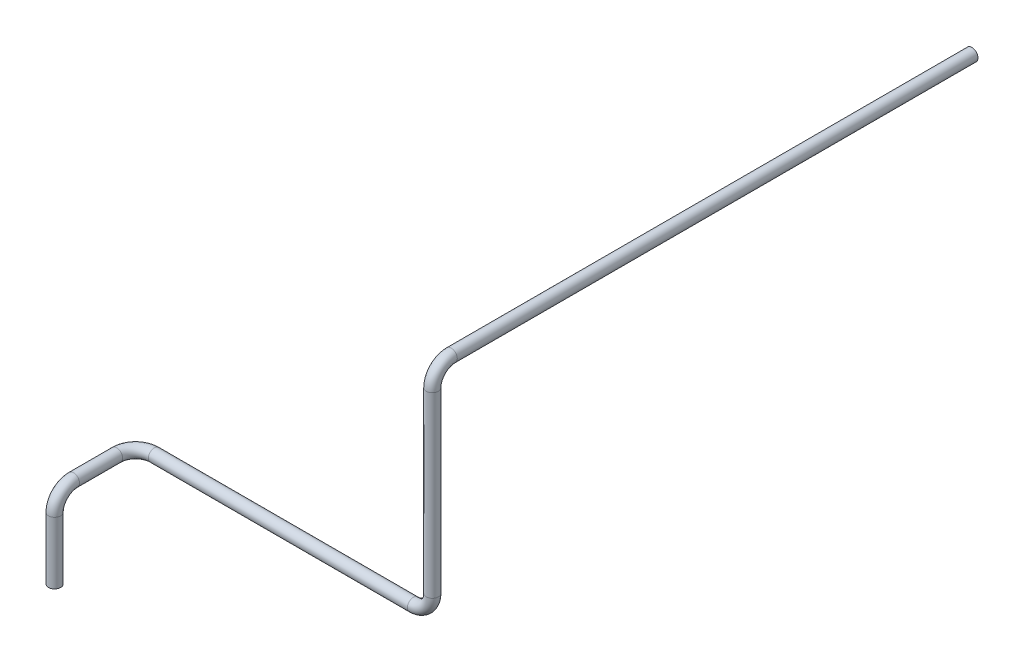
ISO-10303-21;
HEADER;
FILE_DESCRIPTION(('STEP AP214'),'2;1');
FILE_NAME('part.step','',(''),(''),'','','');
FILE_SCHEMA(('AUTOMOTIVE_DESIGN { 1 0 10303 214 1 1 1 1 }'));
ENDSEC;
DATA;
#1=APPLICATION_CONTEXT('core data for automotive mechanical design processes');
#2=APPLICATION_PROTOCOL_DEFINITION('international standard','automotive_design',2000,#1);
#3=PRODUCT_CONTEXT('',#1,'mechanical');
#4=PRODUCT('Part','Part','',(#3));
#5=PRODUCT_RELATED_PRODUCT_CATEGORY('part','',(#4));
#6=PRODUCT_DEFINITION_FORMATION('','',#4);
#7=PRODUCT_DEFINITION_CONTEXT('part definition',#1,'design');
#8=PRODUCT_DEFINITION('design','',#6,#7);
#9=PRODUCT_DEFINITION_SHAPE('','',#8);
#10=(LENGTH_UNIT() NAMED_UNIT(*) SI_UNIT(.MILLI.,.METRE.));
#11=(NAMED_UNIT(*) PLANE_ANGLE_UNIT() SI_UNIT($,.RADIAN.));
#12=(NAMED_UNIT(*) SI_UNIT($,.STERADIAN.) SOLID_ANGLE_UNIT());
#13=UNCERTAINTY_MEASURE_WITH_UNIT(LENGTH_MEASURE(1.E-05),#10,'distance_accuracy_value','');
#14=(GEOMETRIC_REPRESENTATION_CONTEXT(3) GLOBAL_UNCERTAINTY_ASSIGNED_CONTEXT((#13)) GLOBAL_UNIT_ASSIGNED_CONTEXT((#10,
#11,#12)) REPRESENTATION_CONTEXT('',''));
#15=CARTESIAN_POINT('',(0.,0.,0.));
#16=DIRECTION('',(0.,0.,1.));
#17=DIRECTION('',(1.,0.,0.));
#18=AXIS2_PLACEMENT_3D('',#15,#16,#17);
#19=CARTESIAN_POINT('',(0.,0.,100.));
#20=DIRECTION('',(0.,0.,-1.));
#21=DIRECTION('',(-1.,0.,0.));
#22=AXIS2_PLACEMENT_3D('',#19,#20,#21);
#23=CYLINDRICAL_SURFACE('',#22,22.5);
#24=CARTESIAN_POINT('',(0.,0.,0.));
#25=DIRECTION('',(0.,0.,1.));
#26=DIRECTION('',(1.,0.,0.));
#27=AXIS2_PLACEMENT_3D('',#24,#25,#26);
#28=CIRCLE('',#27,22.5);
#29=CARTESIAN_POINT('',(22.5,0.,0.));
#30=VERTEX_POINT('',#29);
#31=EDGE_CURVE('E11',#30,#30,#28,.T.);
#32=ORIENTED_EDGE('',*,*,#31,.T.);
#33=EDGE_LOOP('',(#32));
#34=FACE_BOUND('',#33,.T.);
#35=CARTESIAN_POINT('',(0.,0.,1930.));
#36=DIRECTION('',(0.,0.,1.));
#37=DIRECTION('',(1.,0.,0.));
#38=AXIS2_PLACEMENT_3D('',#35,#36,#37);
#39=CIRCLE('',#38,22.5);
#40=CARTESIAN_POINT('',(0.,22.5,1930.));
#41=VERTEX_POINT('',#40);
#42=EDGE_CURVE('E71',#41,#41,#39,.T.);
#43=ORIENTED_EDGE('',*,*,#42,.F.);
#44=EDGE_LOOP('',(#43));
#45=FACE_BOUND('',#44,.T.);
#46=ADVANCED_FACE('F37',(#34,#45),#23,.T.);
#47=CARTESIAN_POINT('',(0.,0.,0.));
#48=DIRECTION('',(0.,0.,1.));
#49=DIRECTION('',(1.,0.,0.));
#50=AXIS2_PLACEMENT_3D('',#47,#48,#49);
#51=PLANE('',#50);
#52=ORIENTED_EDGE('',*,*,#31,.F.);
#53=EDGE_LOOP('',(#52));
#54=FACE_BOUND('',#53,.T.);
#55=ADVANCED_FACE('F78',(#54),#51,.F.);
#56=CARTESIAN_POINT('',(-1100.,-1100.,2300.));
#57=DIRECTION('',(0.,-1.,0.));
#58=DIRECTION('',(0.,0.,-1.));
#59=AXIS2_PLACEMENT_3D('',#56,#57,#58);
#60=PLANE('',#59);
#61=CARTESIAN_POINT('',(-1100.,-1100.,2300.));
#62=DIRECTION('',(0.,-1.,0.));
#63=DIRECTION('',(0.,0.,-1.));
#64=AXIS2_PLACEMENT_3D('',#61,#62,#63);
#65=CIRCLE('',#64,22.5);
#66=CARTESIAN_POINT('',(-1100.,-1100.,2277.5));
#67=VERTEX_POINT('',#66);
#68=EDGE_CURVE('E43',#67,#67,#65,.T.);
#69=ORIENTED_EDGE('',*,*,#68,.T.);
#70=EDGE_LOOP('',(#69));
#71=FACE_BOUND('',#70,.T.);
#72=ADVANCED_FACE('F47',(#71),#60,.T.);
#73=CARTESIAN_POINT('',(0.,-70.,1930.));
#74=DIRECTION('',(1.,0.,0.));
#75=DIRECTION('',(0.,0.,-1.));
#76=AXIS2_PLACEMENT_3D('',#73,#74,#75);
#77=TOROIDAL_SURFACE('',#76,70.,22.5);
#78=CARTESIAN_POINT('',(0.,-70.,2000.));
#79=DIRECTION('',(0.,-1.,0.));
#80=DIRECTION('',(1.,0.,0.));
#81=AXIS2_PLACEMENT_3D('',#78,#79,#80);
#82=CIRCLE('',#81,22.5);
#83=CARTESIAN_POINT('',(0.,-70.,2022.5));
#84=VERTEX_POINT('',#83);
#85=EDGE_CURVE('E68',#84,#84,#82,.T.);
#86=CARTESIAN_POINT('',(0.,-70.,1930.));
#87=DIRECTION('',(1.,0.,0.));
#88=DIRECTION('',(0.,0.,-1.));
#89=AXIS2_PLACEMENT_3D('',#86,#87,#88);
#90=CIRCLE('',#89,92.5);
#91=EDGE_CURVE('',#41,#84,#90,.T.);
#92=ORIENTED_EDGE('',*,*,#42,.T.);
#93=ORIENTED_EDGE('',*,*,#85,.F.);
#94=ORIENTED_EDGE('',*,*,#91,.T.);
#95=ORIENTED_EDGE('',*,*,#91,.F.);
#96=EDGE_LOOP('',(#92,#94,#93,#95));
#97=FACE_BOUND('',#96,.T.);
#98=ADVANCED_FACE('F75',(#97),#77,.T.);
#99=CARTESIAN_POINT('',(0.,-70.,2000.));
#100=DIRECTION('',(0.,-1.,0.));
#101=DIRECTION('',(0.,0.,-1.));
#102=AXIS2_PLACEMENT_3D('',#99,#100,#101);
#103=CYLINDRICAL_SURFACE('',#102,22.5);
#104=CARTESIAN_POINT('',(0.,-730.,2000.));
#105=DIRECTION('',(0.,-1.,0.));
#106=DIRECTION('',(1.,0.,0.));
#107=AXIS2_PLACEMENT_3D('',#104,#105,#106);
#108=CIRCLE('',#107,22.5);
#109=CARTESIAN_POINT('',(22.5,-730.,2000.));
#110=VERTEX_POINT('',#109);
#111=EDGE_CURVE('E65',#110,#110,#108,.T.);
#112=ORIENTED_EDGE('',*,*,#111,.F.);
#113=EDGE_LOOP('',(#112));
#114=FACE_BOUND('',#113,.T.);
#115=ORIENTED_EDGE('',*,*,#85,.T.);
#116=EDGE_LOOP('',(#115));
#117=FACE_BOUND('',#116,.T.);
#118=ADVANCED_FACE('F115',(#114,#117),#103,.T.);
#119=CARTESIAN_POINT('',(-70.,-730.,2000.));
#120=DIRECTION('',(0.,0.,-1.));
#121=DIRECTION('',(-1.,0.,0.));
#122=AXIS2_PLACEMENT_3D('',#119,#120,#121);
#123=TOROIDAL_SURFACE('',#122,70.,22.5);
#124=CARTESIAN_POINT('',(-70.,-800.,2000.));
#125=DIRECTION('',(-1.,0.,0.));
#126=DIRECTION('',(0.,-1.,0.));
#127=AXIS2_PLACEMENT_3D('',#124,#125,#126);
#128=CIRCLE('',#127,22.5);
#129=CARTESIAN_POINT('',(-70.,-822.5,2000.));
#130=VERTEX_POINT('',#129);
#131=EDGE_CURVE('E62',#130,#130,#128,.T.);
#132=CARTESIAN_POINT('',(-70.,-730.,2000.));
#133=DIRECTION('',(0.,0.,-1.));
#134=DIRECTION('',(-1.,0.,0.));
#135=AXIS2_PLACEMENT_3D('',#132,#133,#134);
#136=CIRCLE('',#135,92.5);
#137=EDGE_CURVE('',#110,#130,#136,.T.);
#138=ORIENTED_EDGE('',*,*,#111,.T.);
#139=ORIENTED_EDGE('',*,*,#131,.F.);
#140=ORIENTED_EDGE('',*,*,#137,.T.);
#141=ORIENTED_EDGE('',*,*,#137,.F.);
#142=EDGE_LOOP('',(#138,#140,#139,#141));
#143=FACE_BOUND('',#142,.T.);
#144=ADVANCED_FACE('F111',(#143),#123,.T.);
#145=CARTESIAN_POINT('',(-70.,-800.,2000.));
#146=DIRECTION('',(-1.,0.,0.));
#147=DIRECTION('',(0.,0.,1.));
#148=AXIS2_PLACEMENT_3D('',#145,#146,#147);
#149=CYLINDRICAL_SURFACE('',#148,22.5);
#150=CARTESIAN_POINT('',(-1030.,-800.,2000.));
#151=DIRECTION('',(-1.,0.,0.));
#152=DIRECTION('',(0.,-1.,0.));
#153=AXIS2_PLACEMENT_3D('',#150,#151,#152);
#154=CIRCLE('',#153,22.5);
#155=CARTESIAN_POINT('',(-1030.,-800.,1977.5));
#156=VERTEX_POINT('',#155);
#157=EDGE_CURVE('E59',#156,#156,#154,.T.);
#158=ORIENTED_EDGE('',*,*,#157,.F.);
#159=EDGE_LOOP('',(#158));
#160=FACE_BOUND('',#159,.T.);
#161=ORIENTED_EDGE('',*,*,#131,.T.);
#162=EDGE_LOOP('',(#161));
#163=FACE_BOUND('',#162,.T.);
#164=ADVANCED_FACE('F107',(#160,#163),#149,.T.);
#165=CARTESIAN_POINT('',(-1030.,-800.,2070.));
#166=DIRECTION('',(0.,1.,0.));
#167=DIRECTION('',(0.,0.,1.));
#168=AXIS2_PLACEMENT_3D('',#165,#166,#167);
#169=TOROIDAL_SURFACE('',#168,69.9999999999998,22.5);
#170=CARTESIAN_POINT('',(-1100.,-800.,2070.));
#171=DIRECTION('',(0.,0.,1.));
#172=DIRECTION('',(0.,-1.,0.));
#173=AXIS2_PLACEMENT_3D('',#170,#171,#172);
#174=CIRCLE('',#173,22.5);
#175=CARTESIAN_POINT('',(-1122.5,-800.,2070.));
#176=VERTEX_POINT('',#175);
#177=EDGE_CURVE('E56',#176,#176,#174,.T.);
#178=CARTESIAN_POINT('',(-1030.,-800.,2070.));
#179=DIRECTION('',(0.,1.,0.));
#180=DIRECTION('',(0.,0.,1.));
#181=AXIS2_PLACEMENT_3D('',#178,#179,#180);
#182=CIRCLE('',#181,92.4999999999998);
#183=EDGE_CURVE('',#156,#176,#182,.T.);
#184=ORIENTED_EDGE('',*,*,#157,.T.);
#185=ORIENTED_EDGE('',*,*,#177,.F.);
#186=ORIENTED_EDGE('',*,*,#183,.T.);
#187=ORIENTED_EDGE('',*,*,#183,.F.);
#188=EDGE_LOOP('',(#184,#186,#185,#187));
#189=FACE_BOUND('',#188,.T.);
#190=ADVANCED_FACE('F103',(#189),#169,.T.);
#191=CARTESIAN_POINT('',(-1100.,-800.,2070.));
#192=DIRECTION('',(0.,0.,1.));
#193=DIRECTION('',(1.,0.,0.));
#194=AXIS2_PLACEMENT_3D('',#191,#192,#193);
#195=CYLINDRICAL_SURFACE('',#194,22.5);
#196=CARTESIAN_POINT('',(-1100.,-800.,2230.));
#197=DIRECTION('',(0.,0.,1.));
#198=DIRECTION('',(0.,-1.,0.));
#199=AXIS2_PLACEMENT_3D('',#196,#197,#198);
#200=CIRCLE('',#199,22.5);
#201=CARTESIAN_POINT('',(-1100.,-777.5,2230.));
#202=VERTEX_POINT('',#201);
#203=EDGE_CURVE('E51',#202,#202,#200,.T.);
#204=ORIENTED_EDGE('',*,*,#203,.F.);
#205=EDGE_LOOP('',(#204));
#206=FACE_BOUND('',#205,.T.);
#207=ORIENTED_EDGE('',*,*,#177,.T.);
#208=EDGE_LOOP('',(#207));
#209=FACE_BOUND('',#208,.T.);
#210=ADVANCED_FACE('F96',(#206,#209),#195,.T.);
#211=CARTESIAN_POINT('',(-1100.,-870.,2230.));
#212=DIRECTION('',(1.,0.,0.));
#213=DIRECTION('',(0.,0.,-1.));
#214=AXIS2_PLACEMENT_3D('',#211,#212,#213);
#215=TOROIDAL_SURFACE('',#214,70.,22.5);
#216=CARTESIAN_POINT('',(-1100.,-870.,2300.));
#217=DIRECTION('',(0.,-1.,0.));
#218=DIRECTION('',(0.,0.,-1.));
#219=AXIS2_PLACEMENT_3D('',#216,#217,#218);
#220=CIRCLE('',#219,22.5);
#221=CARTESIAN_POINT('',(-1100.,-870.,2322.5));
#222=VERTEX_POINT('',#221);
#223=EDGE_CURVE('E49',#222,#222,#220,.T.);
#224=CARTESIAN_POINT('',(-1100.,-870.,2230.));
#225=DIRECTION('',(1.,0.,0.));
#226=DIRECTION('',(0.,0.,-1.));
#227=AXIS2_PLACEMENT_3D('',#224,#225,#226);
#228=CIRCLE('',#227,92.5);
#229=EDGE_CURVE('',#202,#222,#228,.T.);
#230=ORIENTED_EDGE('',*,*,#203,.T.);
#231=ORIENTED_EDGE('',*,*,#223,.F.);
#232=ORIENTED_EDGE('',*,*,#229,.T.);
#233=ORIENTED_EDGE('',*,*,#229,.F.);
#234=EDGE_LOOP('',(#230,#232,#231,#233));
#235=FACE_BOUND('',#234,.T.);
#236=ADVANCED_FACE('F91',(#235),#215,.T.);
#237=CARTESIAN_POINT('',(-1100.,-870.,2300.));
#238=DIRECTION('',(0.,-1.,0.));
#239=DIRECTION('',(0.,0.,-1.));
#240=AXIS2_PLACEMENT_3D('',#237,#238,#239);
#241=CYLINDRICAL_SURFACE('',#240,22.5);
#242=ORIENTED_EDGE('',*,*,#68,.F.);
#243=EDGE_LOOP('',(#242));
#244=FACE_BOUND('',#243,.T.);
#245=ORIENTED_EDGE('',*,*,#223,.T.);
#246=EDGE_LOOP('',(#245));
#247=FACE_BOUND('',#246,.T.);
#248=ADVANCED_FACE('F84',(#244,#247),#241,.T.);
#249=CLOSED_SHELL('',(#46,#55,#72,#98,#118,#144,#164,#190,#210,#236,#248));
#250=MANIFOLD_SOLID_BREP('B2',#249);
#251=ADVANCED_BREP_SHAPE_REPRESENTATION('',(#18,#250),#14);
#252=SHAPE_DEFINITION_REPRESENTATION(#9,#251);
ENDSEC;
END-ISO-10303-21;
